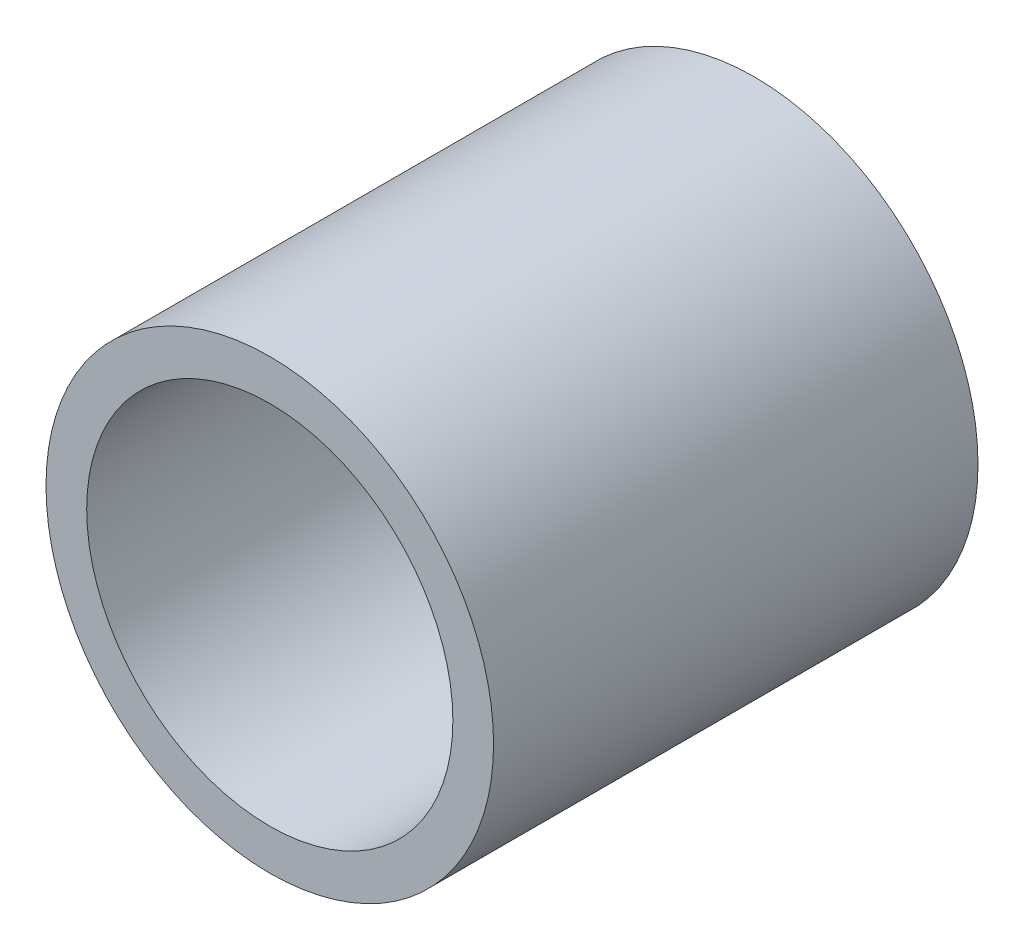
ISO-10303-21;
HEADER;
FILE_DESCRIPTION(('STEP AP214'),'2;1');
FILE_NAME('part.step','',(''),(''),'','','');
FILE_SCHEMA(('AUTOMOTIVE_DESIGN { 1 0 10303 214 1 1 1 1 }'));
ENDSEC;
DATA;
#1=APPLICATION_CONTEXT('core data for automotive mechanical design processes');
#2=APPLICATION_PROTOCOL_DEFINITION('international standard','automotive_design',2000,#1);
#3=PRODUCT_CONTEXT('',#1,'mechanical');
#4=PRODUCT('Part','Part','',(#3));
#5=PRODUCT_RELATED_PRODUCT_CATEGORY('part','',(#4));
#6=PRODUCT_DEFINITION_FORMATION('','',#4);
#7=PRODUCT_DEFINITION_CONTEXT('part definition',#1,'design');
#8=PRODUCT_DEFINITION('design','',#6,#7);
#9=PRODUCT_DEFINITION_SHAPE('','',#8);
#10=(LENGTH_UNIT() NAMED_UNIT(*) SI_UNIT(.MILLI.,.METRE.));
#11=(NAMED_UNIT(*) PLANE_ANGLE_UNIT() SI_UNIT($,.RADIAN.));
#12=(NAMED_UNIT(*) SI_UNIT($,.STERADIAN.) SOLID_ANGLE_UNIT());
#13=UNCERTAINTY_MEASURE_WITH_UNIT(LENGTH_MEASURE(1.E-05),#10,'distance_accuracy_value','');
#14=(GEOMETRIC_REPRESENTATION_CONTEXT(3) GLOBAL_UNCERTAINTY_ASSIGNED_CONTEXT((#13)) GLOBAL_UNIT_ASSIGNED_CONTEXT((#10,
#11,#12)) REPRESENTATION_CONTEXT('',''));
#15=CARTESIAN_POINT('',(0.,0.,0.));
#16=DIRECTION('',(0.,0.,1.));
#17=DIRECTION('',(1.,0.,0.));
#18=AXIS2_PLACEMENT_3D('',#15,#16,#17);
#19=CARTESIAN_POINT('',(0.,0.,0.));
#20=DIRECTION('',(0.,0.,-1.));
#21=DIRECTION('',(-1.,0.,0.));
#22=AXIS2_PLACEMENT_3D('',#19,#20,#21);
#23=PLANE('',#22);
#24=CARTESIAN_POINT('',(0.,0.,0.));
#25=DIRECTION('',(0.,0.,1.));
#26=DIRECTION('',(1.,0.,0.));
#27=AXIS2_PLACEMENT_3D('',#24,#25,#26);
#28=CIRCLE('',#27,9.);
#29=CARTESIAN_POINT('',(9.,0.,0.));
#30=VERTEX_POINT('',#29);
#31=EDGE_CURVE('E46',#30,#30,#28,.T.);
#32=ORIENTED_EDGE('',*,*,#31,.F.);
#33=EDGE_LOOP('',(#32));
#34=FACE_BOUND('',#33,.T.);
#35=CARTESIAN_POINT('',(0.,0.,0.));
#36=DIRECTION('',(0.,0.,1.));
#37=DIRECTION('',(1.,0.,0.));
#38=AXIS2_PLACEMENT_3D('',#35,#36,#37);
#39=CIRCLE('',#38,11.);
#40=CARTESIAN_POINT('',(11.,0.,0.));
#41=VERTEX_POINT('',#40);
#42=EDGE_CURVE('E10',#41,#41,#39,.T.);
#43=ORIENTED_EDGE('',*,*,#42,.T.);
#44=EDGE_LOOP('',(#43));
#45=FACE_BOUND('',#44,.T.);
#46=ADVANCED_FACE('F32',(#34,#45),#23,.F.);
#47=CARTESIAN_POINT('',(0.,0.,-2.19546603119625E-11));
#48=DIRECTION('',(0.,0.,1.));
#49=DIRECTION('',(1.,0.,0.));
#50=AXIS2_PLACEMENT_3D('',#47,#48,#49);
#51=CYLINDRICAL_SURFACE('',#50,11.);
#52=ORIENTED_EDGE('',*,*,#42,.F.);
#53=EDGE_LOOP('',(#52));
#54=FACE_BOUND('',#53,.T.);
#55=CARTESIAN_POINT('',(0.,0.,-23.812));
#56=DIRECTION('',(0.,0.,1.));
#57=DIRECTION('',(1.,0.,0.));
#58=AXIS2_PLACEMENT_3D('',#55,#56,#57);
#59=CIRCLE('',#58,11.);
#60=CARTESIAN_POINT('',(11.,0.,-23.812));
#61=VERTEX_POINT('',#60);
#62=EDGE_CURVE('E38',#61,#61,#59,.T.);
#63=ORIENTED_EDGE('',*,*,#62,.T.);
#64=EDGE_LOOP('',(#63));
#65=FACE_BOUND('',#64,.T.);
#66=ADVANCED_FACE('F56',(#54,#65),#51,.T.);
#67=CARTESIAN_POINT('',(0.,11.,-23.812));
#68=DIRECTION('',(0.,0.,1.));
#69=DIRECTION('',(1.,0.,0.));
#70=AXIS2_PLACEMENT_3D('',#67,#68,#69);
#71=PLANE('',#70);
#72=CARTESIAN_POINT('',(0.,0.,-23.812));
#73=DIRECTION('',(0.,0.,1.));
#74=DIRECTION('',(1.,0.,0.));
#75=AXIS2_PLACEMENT_3D('',#72,#73,#74);
#76=CIRCLE('',#75,9.);
#77=CARTESIAN_POINT('',(9.,0.,-23.812));
#78=VERTEX_POINT('',#77);
#79=EDGE_CURVE('E42',#78,#78,#76,.F.);
#80=ORIENTED_EDGE('',*,*,#79,.F.);
#81=EDGE_LOOP('',(#80));
#82=FACE_BOUND('',#81,.T.);
#83=ORIENTED_EDGE('',*,*,#62,.F.);
#84=EDGE_LOOP('',(#83));
#85=FACE_BOUND('',#84,.T.);
#86=ADVANCED_FACE('F60',(#82,#85),#71,.F.);
#87=CARTESIAN_POINT('',(0.,0.,-23.813));
#88=DIRECTION('',(0.,0.,1.));
#89=DIRECTION('',(1.,0.,0.));
#90=AXIS2_PLACEMENT_3D('',#87,#88,#89);
#91=CYLINDRICAL_SURFACE('',#90,9.);
#92=ORIENTED_EDGE('',*,*,#31,.T.);
#93=EDGE_LOOP('',(#92));
#94=FACE_BOUND('',#93,.T.);
#95=ORIENTED_EDGE('',*,*,#79,.T.);
#96=EDGE_LOOP('',(#95));
#97=FACE_BOUND('',#96,.T.);
#98=ADVANCED_FACE('F52',(#94,#97),#91,.F.);
#99=CLOSED_SHELL('',(#46,#66,#86,#98));
#100=MANIFOLD_SOLID_BREP('B2',#99);
#101=ADVANCED_BREP_SHAPE_REPRESENTATION('',(#18,#100),#14);
#102=SHAPE_DEFINITION_REPRESENTATION(#9,#101);
ENDSEC;
END-ISO-10303-21;
